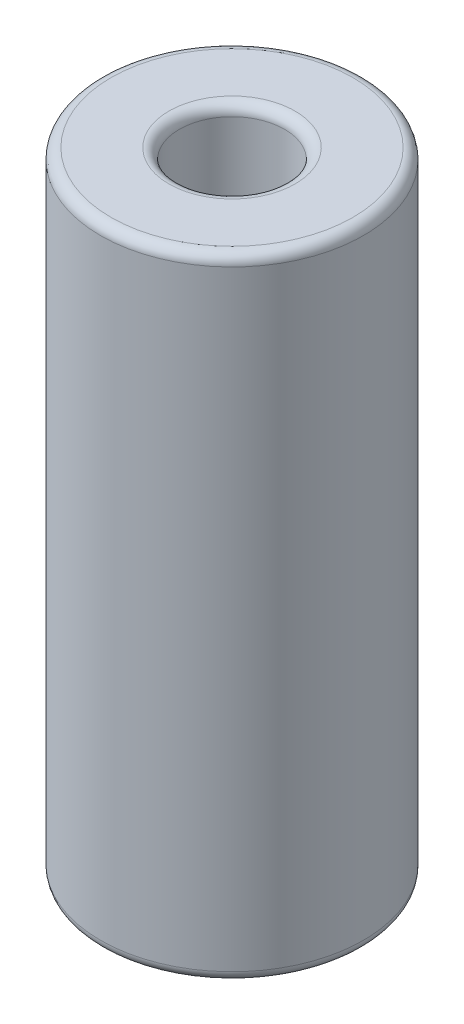
ISO-10303-21;
HEADER;
FILE_DESCRIPTION(('STEP AP214'),'2;1');
FILE_NAME('part.step','',(''),(''),'','','');
FILE_SCHEMA(('AUTOMOTIVE_DESIGN { 1 0 10303 214 1 1 1 1 }'));
ENDSEC;
DATA;
#1=APPLICATION_CONTEXT('core data for automotive mechanical design processes');
#2=APPLICATION_PROTOCOL_DEFINITION('international standard','automotive_design',2000,#1);
#3=PRODUCT_CONTEXT('',#1,'mechanical');
#4=PRODUCT('Part','Part','',(#3));
#5=PRODUCT_RELATED_PRODUCT_CATEGORY('part','',(#4));
#6=PRODUCT_DEFINITION_FORMATION('','',#4);
#7=PRODUCT_DEFINITION_CONTEXT('part definition',#1,'design');
#8=PRODUCT_DEFINITION('design','',#6,#7);
#9=PRODUCT_DEFINITION_SHAPE('','',#8);
#10=(LENGTH_UNIT() NAMED_UNIT(*) SI_UNIT(.MILLI.,.METRE.));
#11=(NAMED_UNIT(*) PLANE_ANGLE_UNIT() SI_UNIT($,.RADIAN.));
#12=(NAMED_UNIT(*) SI_UNIT($,.STERADIAN.) SOLID_ANGLE_UNIT());
#13=UNCERTAINTY_MEASURE_WITH_UNIT(LENGTH_MEASURE(1.E-05),#10,'distance_accuracy_value','');
#14=(GEOMETRIC_REPRESENTATION_CONTEXT(3) GLOBAL_UNCERTAINTY_ASSIGNED_CONTEXT((#13)) GLOBAL_UNIT_ASSIGNED_CONTEXT((#10,
#11,#12)) REPRESENTATION_CONTEXT('',''));
#15=CARTESIAN_POINT('',(0.,0.,0.));
#16=DIRECTION('',(0.,0.,1.));
#17=DIRECTION('',(1.,0.,0.));
#18=AXIS2_PLACEMENT_3D('',#15,#16,#17);
#19=CARTESIAN_POINT('',(0.,152.4,0.));
#20=DIRECTION('',(0.,1.,0.));
#21=DIRECTION('',(0.,0.,1.));
#22=AXIS2_PLACEMENT_3D('',#19,#20,#21);
#23=PLANE('',#22);
#24=CARTESIAN_POINT('',(0.,152.4,0.));
#25=DIRECTION('',(0.,1.,0.));
#26=DIRECTION('',(0.,0.,1.));
#27=AXIS2_PLACEMENT_3D('',#24,#25,#26);
#28=CIRCLE('',#27,29.21);
#29=CARTESIAN_POINT('',(0.,152.4,29.21));
#30=VERTEX_POINT('',#29);
#31=EDGE_CURVE('E10',#30,#30,#28,.T.);
#32=ORIENTED_EDGE('',*,*,#31,.T.);
#33=EDGE_LOOP('',(#32));
#34=FACE_BOUND('',#33,.T.);
#35=CARTESIAN_POINT('',(0.,152.4,0.));
#36=DIRECTION('',(0.,1.,0.));
#37=DIRECTION('',(0.,0.,1.));
#38=AXIS2_PLACEMENT_3D('',#35,#36,#37);
#39=CIRCLE('',#38,15.24);
#40=CARTESIAN_POINT('',(0.,152.4,15.24));
#41=VERTEX_POINT('',#40);
#42=EDGE_CURVE('E38',#41,#41,#39,.F.);
#43=ORIENTED_EDGE('',*,*,#42,.T.);
#44=EDGE_LOOP('',(#43));
#45=FACE_BOUND('',#44,.T.);
#46=ADVANCED_FACE('F31',(#34,#45),#23,.T.);
#47=CARTESIAN_POINT('',(0.,0.,0.));
#48=DIRECTION('',(0.,1.,0.));
#49=DIRECTION('',(0.,0.,1.));
#50=AXIS2_PLACEMENT_3D('',#47,#48,#49);
#51=PLANE('',#50);
#52=CARTESIAN_POINT('',(0.,0.,0.));
#53=DIRECTION('',(0.,1.,0.));
#54=DIRECTION('',(0.,0.,1.));
#55=AXIS2_PLACEMENT_3D('',#52,#53,#54);
#56=CIRCLE('',#55,15.24);
#57=CARTESIAN_POINT('',(0.,0.,15.24));
#58=VERTEX_POINT('',#57);
#59=EDGE_CURVE('E57',#58,#58,#56,.T.);
#60=ORIENTED_EDGE('',*,*,#59,.T.);
#61=EDGE_LOOP('',(#60));
#62=FACE_BOUND('',#61,.T.);
#63=CARTESIAN_POINT('',(0.,0.,0.));
#64=DIRECTION('',(0.,1.,0.));
#65=DIRECTION('',(0.,0.,1.));
#66=AXIS2_PLACEMENT_3D('',#63,#64,#65);
#67=CIRCLE('',#66,29.21);
#68=CARTESIAN_POINT('',(0.,0.,29.21));
#69=VERTEX_POINT('',#68);
#70=EDGE_CURVE('E60',#69,#69,#67,.F.);
#71=ORIENTED_EDGE('',*,*,#70,.T.);
#72=EDGE_LOOP('',(#71));
#73=FACE_BOUND('',#72,.T.);
#74=ADVANCED_FACE('F64',(#62,#73),#51,.F.);
#75=CARTESIAN_POINT('',(0.,152.4,0.));
#76=DIRECTION('',(0.,-1.,0.));
#77=DIRECTION('',(0.,0.,-1.));
#78=AXIS2_PLACEMENT_3D('',#75,#76,#77);
#79=CYLINDRICAL_SURFACE('',#78,31.75);
#80=CARTESIAN_POINT('',(0.,2.53999999999999,0.));
#81=DIRECTION('',(0.,1.,0.));
#82=DIRECTION('',(0.,0.,1.));
#83=AXIS2_PLACEMENT_3D('',#80,#81,#82);
#84=CIRCLE('',#83,31.75);
#85=CARTESIAN_POINT('',(0.,2.53999999999999,-31.75));
#86=VERTEX_POINT('',#85);
#87=EDGE_CURVE('E42',#86,#86,#84,.T.);
#88=CARTESIAN_POINT('',(0.,149.86,0.));
#89=DIRECTION('',(0.,1.,0.));
#90=DIRECTION('',(0.,0.,1.));
#91=AXIS2_PLACEMENT_3D('',#88,#89,#90);
#92=CIRCLE('',#91,31.75);
#93=CARTESIAN_POINT('',(0.,149.86,-31.75));
#94=VERTEX_POINT('',#93);
#95=EDGE_CURVE('E46',#94,#94,#92,.F.);
#96=CARTESIAN_POINT('',(0.,2.53999999999999,-31.75));
#97=CARTESIAN_POINT('',(0.,4.07458333333332,-31.75));
#98=CARTESIAN_POINT('',(0.,5.60916666666665,-31.75));
#99=CARTESIAN_POINT('',(0.,8.67833333333332,-31.75));
#100=CARTESIAN_POINT('',(0.,10.2129166666667,-31.75));
#101=CARTESIAN_POINT('',(0.,13.2820833333333,-31.75));
#102=CARTESIAN_POINT('',(0.,14.8166666666667,-31.75));
#103=CARTESIAN_POINT('',(0.,17.8858333333333,-31.75));
#104=CARTESIAN_POINT('',(0.,19.4204166666667,-31.75));
#105=CARTESIAN_POINT('',(0.,22.4895833333333,-31.75));
#106=CARTESIAN_POINT('',(0.,24.0241666666667,-31.75));
#107=CARTESIAN_POINT('',(0.,27.0933333333333,-31.75));
#108=CARTESIAN_POINT('',(0.,28.6279166666667,-31.75));
#109=CARTESIAN_POINT('',(0.,31.6970833333333,-31.75));
#110=CARTESIAN_POINT('',(0.,33.2316666666667,-31.75));
#111=CARTESIAN_POINT('',(0.,36.3008333333333,-31.75));
#112=CARTESIAN_POINT('',(0.,37.8354166666667,-31.75));
#113=CARTESIAN_POINT('',(0.,40.9045833333333,-31.75));
#114=CARTESIAN_POINT('',(0.,42.4391666666667,-31.75));
#115=CARTESIAN_POINT('',(0.,45.5083333333333,-31.75));
#116=CARTESIAN_POINT('',(0.,47.0429166666667,-31.75));
#117=CARTESIAN_POINT('',(0.,50.1120833333333,-31.75));
#118=CARTESIAN_POINT('',(0.,51.6466666666667,-31.75));
#119=CARTESIAN_POINT('',(0.,54.7158333333333,-31.75));
#120=CARTESIAN_POINT('',(0.,56.2504166666667,-31.75));
#121=CARTESIAN_POINT('',(0.,59.3195833333333,-31.75));
#122=CARTESIAN_POINT('',(0.,60.8541666666667,-31.75));
#123=CARTESIAN_POINT('',(0.,63.9233333333333,-31.75));
#124=CARTESIAN_POINT('',(0.,65.4579166666667,-31.75));
#125=CARTESIAN_POINT('',(0.,68.5270833333333,-31.75));
#126=CARTESIAN_POINT('',(0.,70.0616666666667,-31.75));
#127=CARTESIAN_POINT('',(0.,73.1308333333333,-31.75));
#128=CARTESIAN_POINT('',(0.,74.6654166666667,-31.75));
#129=CARTESIAN_POINT('',(0.,77.7345833333333,-31.75));
#130=CARTESIAN_POINT('',(0.,79.2691666666667,-31.75));
#131=CARTESIAN_POINT('',(0.,82.3383333333334,-31.75));
#132=CARTESIAN_POINT('',(0.,83.8729166666667,-31.75));
#133=CARTESIAN_POINT('',(0.,86.9420833333333,-31.75));
#134=CARTESIAN_POINT('',(0.,88.4766666666667,-31.75));
#135=CARTESIAN_POINT('',(0.,91.5458333333333,-31.75));
#136=CARTESIAN_POINT('',(0.,93.0804166666667,-31.75));
#137=CARTESIAN_POINT('',(0.,96.1495833333333,-31.75));
#138=CARTESIAN_POINT('',(0.,97.6841666666667,-31.75));
#139=CARTESIAN_POINT('',(0.,100.753333333333,-31.75));
#140=CARTESIAN_POINT('',(0.,102.287916666667,-31.75));
#141=CARTESIAN_POINT('',(0.,105.357083333333,-31.75));
#142=CARTESIAN_POINT('',(0.,106.891666666667,-31.75));
#143=CARTESIAN_POINT('',(0.,109.960833333333,-31.75));
#144=CARTESIAN_POINT('',(0.,111.495416666667,-31.75));
#145=CARTESIAN_POINT('',(0.,114.564583333333,-31.75));
#146=CARTESIAN_POINT('',(0.,116.099166666667,-31.75));
#147=CARTESIAN_POINT('',(0.,119.168333333333,-31.75));
#148=CARTESIAN_POINT('',(0.,120.702916666667,-31.75));
#149=CARTESIAN_POINT('',(0.,123.772083333333,-31.75));
#150=CARTESIAN_POINT('',(0.,125.306666666667,-31.75));
#151=CARTESIAN_POINT('',(0.,128.375833333333,-31.75));
#152=CARTESIAN_POINT('',(0.,129.910416666667,-31.75));
#153=CARTESIAN_POINT('',(0.,132.979583333333,-31.75));
#154=CARTESIAN_POINT('',(0.,134.514166666667,-31.75));
#155=CARTESIAN_POINT('',(0.,137.583333333333,-31.75));
#156=CARTESIAN_POINT('',(0.,139.117916666667,-31.75));
#157=CARTESIAN_POINT('',(0.,142.187083333333,-31.75));
#158=CARTESIAN_POINT('',(0.,143.721666666667,-31.75));
#159=CARTESIAN_POINT('',(0.,146.790833333333,-31.75));
#160=CARTESIAN_POINT('',(0.,148.325416666667,-31.75));
#161=CARTESIAN_POINT('',(0.,149.86,-31.75));
#162=B_SPLINE_CURVE_WITH_KNOTS('',3,(#96,#97,#98,#99,#100,#101,#102,#103,#104,#105,#106,#107,
#108,#109,#110,#111,#112,#113,#114,#115,#116,#117,#118,#119,#120,#121,#122,#123,#124,#125,#126,
#127,#128,#129,#130,#131,#132,#133,#134,#135,#136,#137,#138,#139,#140,#141,#142,#143,#144,#145,
#146,#147,#148,#149,#150,#151,#152,#153,#154,#155,#156,#157,#158,#159,#160,#161),.UNSPECIFIED.,
.F.,.F.,(4,2,2,2,2,2,2,2,2,2,2,2,2,2,2,2,2,2,2,2,2,2,2,2,2,2,2,2,2,2,2,2,4),(0.,
4.60374999999999,9.20750000000001,13.81125,18.415,23.01875,27.6225,32.22625,36.83,41.43375,
46.0375,50.64125,55.245,59.84875,64.4525,69.05625,73.66,78.26375,82.8675,87.47125,92.075,
96.67875,101.2825,105.88625,110.49,115.09375,119.6975,124.30125,128.905,133.50875,138.1125,
142.71625,147.32),.UNSPECIFIED.);
#163=EDGE_CURVE('BSEAM74',#86,#94,#162,.T.);
#164=ORIENTED_EDGE('',*,*,#87,.T.);
#165=ORIENTED_EDGE('',*,*,#95,.T.);
#166=ORIENTED_EDGE('',*,*,#163,.T.);
#167=ORIENTED_EDGE('',*,*,#163,.F.);
#168=EDGE_LOOP('',(#164,#166,#165,#167));
#169=FACE_BOUND('',#168,.T.);
#170=ADVANCED_FACE('F74',(#169),#79,.T.);
#171=CARTESIAN_POINT('',(0.,152.4,0.));
#172=DIRECTION('',(0.,-1.,0.));
#173=DIRECTION('',(0.,0.,-1.));
#174=AXIS2_PLACEMENT_3D('',#171,#172,#173);
#175=CYLINDRICAL_SURFACE('',#174,12.7);
#176=CARTESIAN_POINT('',(0.,2.53999999999999,0.));
#177=DIRECTION('',(0.,1.,0.));
#178=DIRECTION('',(0.,0.,1.));
#179=AXIS2_PLACEMENT_3D('',#176,#177,#178);
#180=CIRCLE('',#179,12.7);
#181=CARTESIAN_POINT('',(0.,2.53999999999999,-12.7));
#182=VERTEX_POINT('',#181);
#183=EDGE_CURVE('E51',#182,#182,#180,.F.);
#184=CARTESIAN_POINT('',(0.,149.86,0.));
#185=DIRECTION('',(0.,1.,0.));
#186=DIRECTION('',(0.,0.,1.));
#187=AXIS2_PLACEMENT_3D('',#184,#185,#186);
#188=CIRCLE('',#187,12.7);
#189=CARTESIAN_POINT('',(0.,149.86,-12.7));
#190=VERTEX_POINT('',#189);
#191=EDGE_CURVE('E54',#190,#190,#188,.T.);
#192=CARTESIAN_POINT('',(0.,2.53999999999999,-12.7));
#193=CARTESIAN_POINT('',(0.,4.07458333333332,-12.7));
#194=CARTESIAN_POINT('',(0.,5.60916666666665,-12.7));
#195=CARTESIAN_POINT('',(0.,8.67833333333332,-12.7));
#196=CARTESIAN_POINT('',(0.,10.2129166666667,-12.7));
#197=CARTESIAN_POINT('',(0.,13.2820833333333,-12.7));
#198=CARTESIAN_POINT('',(0.,14.8166666666667,-12.7));
#199=CARTESIAN_POINT('',(0.,17.8858333333333,-12.7));
#200=CARTESIAN_POINT('',(0.,19.4204166666667,-12.7));
#201=CARTESIAN_POINT('',(0.,22.4895833333333,-12.7));
#202=CARTESIAN_POINT('',(0.,24.0241666666667,-12.7));
#203=CARTESIAN_POINT('',(0.,27.0933333333333,-12.7));
#204=CARTESIAN_POINT('',(0.,28.6279166666667,-12.7));
#205=CARTESIAN_POINT('',(0.,31.6970833333333,-12.7));
#206=CARTESIAN_POINT('',(0.,33.2316666666667,-12.7));
#207=CARTESIAN_POINT('',(0.,36.3008333333333,-12.7));
#208=CARTESIAN_POINT('',(0.,37.8354166666667,-12.7));
#209=CARTESIAN_POINT('',(0.,40.9045833333333,-12.7));
#210=CARTESIAN_POINT('',(0.,42.4391666666667,-12.7));
#211=CARTESIAN_POINT('',(0.,45.5083333333333,-12.7));
#212=CARTESIAN_POINT('',(0.,47.0429166666667,-12.7));
#213=CARTESIAN_POINT('',(0.,50.1120833333333,-12.7));
#214=CARTESIAN_POINT('',(0.,51.6466666666667,-12.7));
#215=CARTESIAN_POINT('',(0.,54.7158333333333,-12.7));
#216=CARTESIAN_POINT('',(0.,56.2504166666667,-12.7));
#217=CARTESIAN_POINT('',(0.,59.3195833333333,-12.7));
#218=CARTESIAN_POINT('',(0.,60.8541666666667,-12.7));
#219=CARTESIAN_POINT('',(0.,63.9233333333333,-12.7));
#220=CARTESIAN_POINT('',(0.,65.4579166666667,-12.7));
#221=CARTESIAN_POINT('',(0.,68.5270833333333,-12.7));
#222=CARTESIAN_POINT('',(0.,70.0616666666667,-12.7));
#223=CARTESIAN_POINT('',(0.,73.1308333333333,-12.7));
#224=CARTESIAN_POINT('',(0.,74.6654166666667,-12.7));
#225=CARTESIAN_POINT('',(0.,77.7345833333333,-12.7));
#226=CARTESIAN_POINT('',(0.,79.2691666666667,-12.7));
#227=CARTESIAN_POINT('',(0.,82.3383333333334,-12.7));
#228=CARTESIAN_POINT('',(0.,83.8729166666667,-12.7));
#229=CARTESIAN_POINT('',(0.,86.9420833333333,-12.7));
#230=CARTESIAN_POINT('',(0.,88.4766666666667,-12.7));
#231=CARTESIAN_POINT('',(0.,91.5458333333333,-12.7));
#232=CARTESIAN_POINT('',(0.,93.0804166666667,-12.7));
#233=CARTESIAN_POINT('',(0.,96.1495833333333,-12.7));
#234=CARTESIAN_POINT('',(0.,97.6841666666667,-12.7));
#235=CARTESIAN_POINT('',(0.,100.753333333333,-12.7));
#236=CARTESIAN_POINT('',(0.,102.287916666667,-12.7));
#237=CARTESIAN_POINT('',(0.,105.357083333333,-12.7));
#238=CARTESIAN_POINT('',(0.,106.891666666667,-12.7));
#239=CARTESIAN_POINT('',(0.,109.960833333333,-12.7));
#240=CARTESIAN_POINT('',(0.,111.495416666667,-12.7));
#241=CARTESIAN_POINT('',(0.,114.564583333333,-12.7));
#242=CARTESIAN_POINT('',(0.,116.099166666667,-12.7));
#243=CARTESIAN_POINT('',(0.,119.168333333333,-12.7));
#244=CARTESIAN_POINT('',(0.,120.702916666667,-12.7));
#245=CARTESIAN_POINT('',(0.,123.772083333333,-12.7));
#246=CARTESIAN_POINT('',(0.,125.306666666667,-12.7));
#247=CARTESIAN_POINT('',(0.,128.375833333333,-12.7));
#248=CARTESIAN_POINT('',(0.,129.910416666667,-12.7));
#249=CARTESIAN_POINT('',(0.,132.979583333333,-12.7));
#250=CARTESIAN_POINT('',(0.,134.514166666667,-12.7));
#251=CARTESIAN_POINT('',(0.,137.583333333333,-12.7));
#252=CARTESIAN_POINT('',(0.,139.117916666667,-12.7));
#253=CARTESIAN_POINT('',(0.,142.187083333333,-12.7));
#254=CARTESIAN_POINT('',(0.,143.721666666667,-12.7));
#255=CARTESIAN_POINT('',(0.,146.790833333333,-12.7));
#256=CARTESIAN_POINT('',(0.,148.325416666667,-12.7));
#257=CARTESIAN_POINT('',(0.,149.86,-12.7));
#258=B_SPLINE_CURVE_WITH_KNOTS('',3,(#192,#193,#194,#195,#196,#197,#198,#199,#200,#201,#202,
#203,#204,#205,#206,#207,#208,#209,#210,#211,#212,#213,#214,#215,#216,#217,#218,#219,#220,#221,
#222,#223,#224,#225,#226,#227,#228,#229,#230,#231,#232,#233,#234,#235,#236,#237,#238,#239,#240,
#241,#242,#243,#244,#245,#246,#247,#248,#249,#250,#251,#252,#253,#254,#255,#256,#257),
.UNSPECIFIED.,.F.,.F.,(4,2,2,2,2,2,2,2,2,2,2,2,2,2,2,2,2,2,2,2,2,2,2,2,2,2,2,2,2,2,2,2,4),(0.,
4.60374999999999,9.20750000000001,13.81125,18.415,23.01875,27.6225,32.22625,36.83,41.43375,
46.0375,50.64125,55.245,59.84875,64.4525,69.05625,73.66,78.26375,82.8675,87.47125,92.075,
96.67875,101.2825,105.88625,110.49,115.09375,119.6975,124.30125,128.905,133.50875,138.1125,
142.71625,147.32),.UNSPECIFIED.);
#259=EDGE_CURVE('BSEAM77',#182,#190,#258,.T.);
#260=ORIENTED_EDGE('',*,*,#183,.T.);
#261=ORIENTED_EDGE('',*,*,#191,.T.);
#262=ORIENTED_EDGE('',*,*,#259,.T.);
#263=ORIENTED_EDGE('',*,*,#259,.F.);
#264=EDGE_LOOP('',(#260,#262,#261,#263));
#265=FACE_BOUND('',#264,.T.);
#266=ADVANCED_FACE('F77',(#265),#175,.F.);
#267=CARTESIAN_POINT('',(0.,2.53999999999999,0.));
#268=DIRECTION('',(0.,1.,0.));
#269=DIRECTION('',(0.,0.,1.));
#270=AXIS2_PLACEMENT_3D('',#267,#268,#269);
#271=TOROIDAL_SURFACE('',#270,15.24,2.54);
#272=ORIENTED_EDGE('',*,*,#183,.F.);
#273=EDGE_LOOP('',(#272));
#274=FACE_BOUND('',#273,.T.);
#275=ORIENTED_EDGE('',*,*,#59,.F.);
#276=EDGE_LOOP('',(#275));
#277=FACE_BOUND('',#276,.T.);
#278=ADVANCED_FACE('F70',(#274,#277),#271,.T.);
#279=CARTESIAN_POINT('',(0.,2.53999999999999,0.));
#280=DIRECTION('',(0.,1.,0.));
#281=DIRECTION('',(0.,0.,1.));
#282=AXIS2_PLACEMENT_3D('',#279,#280,#281);
#283=TOROIDAL_SURFACE('',#282,29.21,2.54);
#284=ORIENTED_EDGE('',*,*,#70,.F.);
#285=EDGE_LOOP('',(#284));
#286=FACE_BOUND('',#285,.T.);
#287=ORIENTED_EDGE('',*,*,#87,.F.);
#288=EDGE_LOOP('',(#287));
#289=FACE_BOUND('',#288,.T.);
#290=ADVANCED_FACE('F66',(#286,#289),#283,.T.);
#291=CARTESIAN_POINT('',(0.,149.86,0.));
#292=DIRECTION('',(0.,1.,0.));
#293=DIRECTION('',(0.,0.,1.));
#294=AXIS2_PLACEMENT_3D('',#291,#292,#293);
#295=TOROIDAL_SURFACE('',#294,29.21,2.54);
#296=ORIENTED_EDGE('',*,*,#95,.F.);
#297=EDGE_LOOP('',(#296));
#298=FACE_BOUND('',#297,.T.);
#299=ORIENTED_EDGE('',*,*,#31,.F.);
#300=EDGE_LOOP('',(#299));
#301=FACE_BOUND('',#300,.T.);
#302=ADVANCED_FACE('F69',(#298,#301),#295,.T.);
#303=CARTESIAN_POINT('',(0.,149.86,0.));
#304=DIRECTION('',(0.,1.,0.));
#305=DIRECTION('',(0.,0.,1.));
#306=AXIS2_PLACEMENT_3D('',#303,#304,#305);
#307=TOROIDAL_SURFACE('',#306,15.24,2.54);
#308=ORIENTED_EDGE('',*,*,#42,.F.);
#309=EDGE_LOOP('',(#308));
#310=FACE_BOUND('',#309,.T.);
#311=ORIENTED_EDGE('',*,*,#191,.F.);
#312=EDGE_LOOP('',(#311));
#313=FACE_BOUND('',#312,.T.);
#314=ADVANCED_FACE('F33',(#310,#313),#307,.T.);
#315=CLOSED_SHELL('',(#46,#74,#170,#266,#278,#290,#302,#314));
#316=MANIFOLD_SOLID_BREP('B2',#315);
#317=ADVANCED_BREP_SHAPE_REPRESENTATION('',(#18,#316),#14);
#318=SHAPE_DEFINITION_REPRESENTATION(#9,#317);
ENDSEC;
END-ISO-10303-21;
